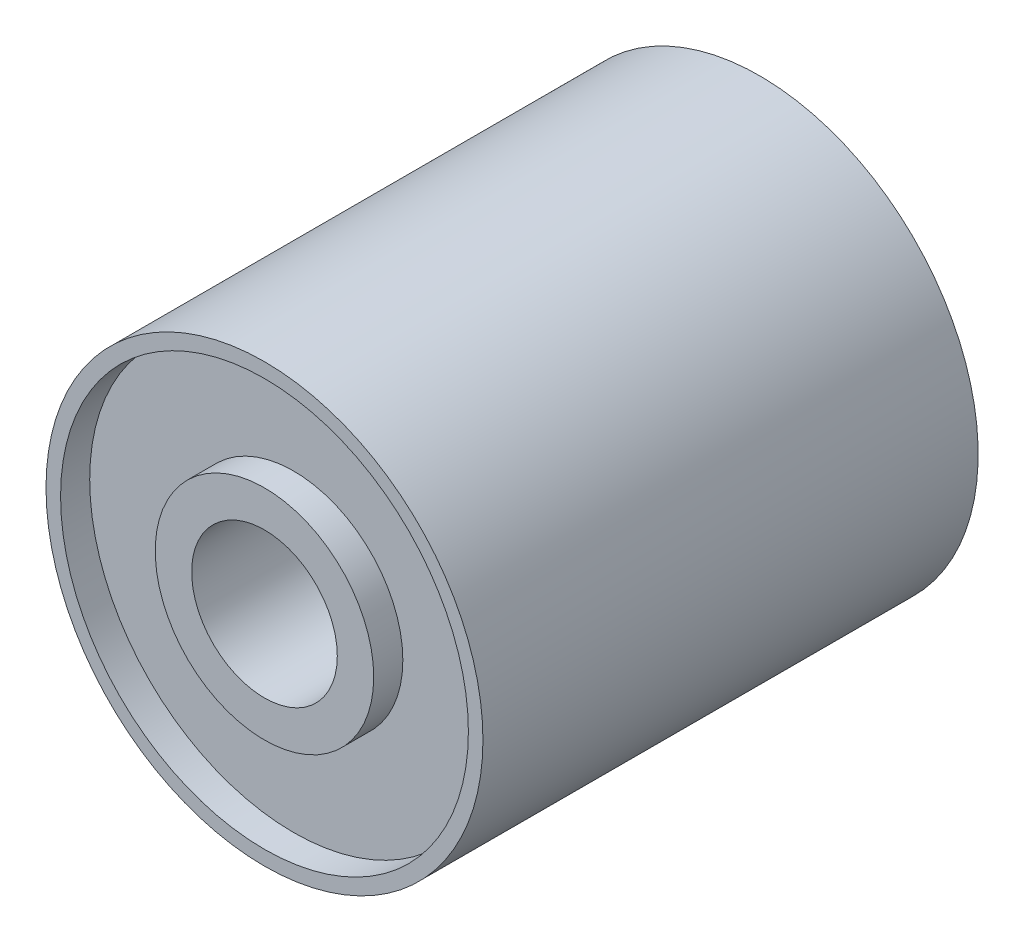
ISO-10303-21;
HEADER;
FILE_DESCRIPTION(('STEP AP214'),'2;1');
FILE_NAME('part.step','',(''),(''),'','','');
FILE_SCHEMA(('AUTOMOTIVE_DESIGN { 1 0 10303 214 1 1 1 1 }'));
ENDSEC;
DATA;
#1=APPLICATION_CONTEXT('core data for automotive mechanical design processes');
#2=APPLICATION_PROTOCOL_DEFINITION('international standard','automotive_design',2000,#1);
#3=PRODUCT_CONTEXT('',#1,'mechanical');
#4=PRODUCT('Part','Part','',(#3));
#5=PRODUCT_RELATED_PRODUCT_CATEGORY('part','',(#4));
#6=PRODUCT_DEFINITION_FORMATION('','',#4);
#7=PRODUCT_DEFINITION_CONTEXT('part definition',#1,'design');
#8=PRODUCT_DEFINITION('design','',#6,#7);
#9=PRODUCT_DEFINITION_SHAPE('','',#8);
#10=(LENGTH_UNIT() NAMED_UNIT(*) SI_UNIT(.MILLI.,.METRE.));
#11=(NAMED_UNIT(*) PLANE_ANGLE_UNIT() SI_UNIT($,.RADIAN.));
#12=(NAMED_UNIT(*) SI_UNIT($,.STERADIAN.) SOLID_ANGLE_UNIT());
#13=UNCERTAINTY_MEASURE_WITH_UNIT(LENGTH_MEASURE(1.E-05),#10,'distance_accuracy_value','');
#14=(GEOMETRIC_REPRESENTATION_CONTEXT(3) GLOBAL_UNCERTAINTY_ASSIGNED_CONTEXT((#13)) GLOBAL_UNIT_ASSIGNED_CONTEXT((#10,
#11,#12)) REPRESENTATION_CONTEXT('',''));
#15=CARTESIAN_POINT('',(0.,0.,0.));
#16=DIRECTION('',(0.,0.,1.));
#17=DIRECTION('',(1.,0.,0.));
#18=AXIS2_PLACEMENT_3D('',#15,#16,#17);
#19=CARTESIAN_POINT('',(0.,0.,3.));
#20=DIRECTION('',(0.,0.,-1.));
#21=DIRECTION('',(-1.,0.,0.));
#22=AXIS2_PLACEMENT_3D('',#19,#20,#21);
#23=CYLINDRICAL_SURFACE('',#22,1.5);
#24=CARTESIAN_POINT('',(0.,0.,3.2));
#25=DIRECTION('',(0.,0.,1.));
#26=DIRECTION('',(1.,0.,0.));
#27=AXIS2_PLACEMENT_3D('',#24,#25,#26);
#28=CIRCLE('',#27,1.5);
#29=CARTESIAN_POINT('',(1.5,0.,3.2));
#30=VERTEX_POINT('',#29);
#31=EDGE_CURVE('E43',#30,#30,#28,.T.);
#32=ORIENTED_EDGE('',*,*,#31,.F.);
#33=EDGE_LOOP('',(#32));
#34=FACE_BOUND('',#33,.T.);
#35=CARTESIAN_POINT('',(0.,0.,-0.2));
#36=DIRECTION('',(0.,0.,-1.));
#37=DIRECTION('',(-1.,0.,0.));
#38=AXIS2_PLACEMENT_3D('',#35,#36,#37);
#39=CIRCLE('',#38,1.5);
#40=CARTESIAN_POINT('',(-1.5,0.,-0.2));
#41=VERTEX_POINT('',#40);
#42=EDGE_CURVE('E52',#41,#41,#39,.T.);
#43=ORIENTED_EDGE('',*,*,#42,.F.);
#44=EDGE_LOOP('',(#43));
#45=FACE_BOUND('',#44,.T.);
#46=ADVANCED_FACE('F33',(#34,#45),#23,.T.);
#47=CARTESIAN_POINT('',(0.,0.,3.2));
#48=DIRECTION('',(0.,0.,1.));
#49=DIRECTION('',(1.,0.,0.));
#50=AXIS2_PLACEMENT_3D('',#47,#48,#49);
#51=PLANE('',#50);
#52=ORIENTED_EDGE('',*,*,#31,.T.);
#53=EDGE_LOOP('',(#52));
#54=FACE_BOUND('',#53,.T.);
#55=CARTESIAN_POINT('',(0.,0.,3.2));
#56=DIRECTION('',(0.,0.,1.));
#57=DIRECTION('',(1.,0.,0.));
#58=AXIS2_PLACEMENT_3D('',#55,#56,#57);
#59=CIRCLE('',#58,1.4);
#60=CARTESIAN_POINT('',(1.4,0.,3.2));
#61=VERTEX_POINT('',#60);
#62=EDGE_CURVE('E47',#61,#61,#59,.T.);
#63=ORIENTED_EDGE('',*,*,#62,.F.);
#64=EDGE_LOOP('',(#63));
#65=FACE_BOUND('',#64,.T.);
#66=ADVANCED_FACE('F94',(#54,#65),#51,.T.);
#67=CARTESIAN_POINT('',(0.,0.,3.2));
#68=DIRECTION('',(0.,0.,-1.));
#69=DIRECTION('',(-1.,0.,0.));
#70=AXIS2_PLACEMENT_3D('',#67,#68,#69);
#71=CYLINDRICAL_SURFACE('',#70,1.4);
#72=ORIENTED_EDGE('',*,*,#62,.T.);
#73=EDGE_LOOP('',(#72));
#74=FACE_BOUND('',#73,.T.);
#75=CARTESIAN_POINT('',(0.,0.,3.));
#76=DIRECTION('',(0.,0.,1.));
#77=DIRECTION('',(1.,0.,0.));
#78=AXIS2_PLACEMENT_3D('',#75,#76,#77);
#79=CIRCLE('',#78,1.4);
#80=CARTESIAN_POINT('',(1.4,0.,3.));
#81=VERTEX_POINT('',#80);
#82=EDGE_CURVE('E39',#81,#81,#79,.F.);
#83=ORIENTED_EDGE('',*,*,#82,.T.);
#84=EDGE_LOOP('',(#83));
#85=FACE_BOUND('',#84,.T.);
#86=ADVANCED_FACE('F99',(#74,#85),#71,.F.);
#87=CARTESIAN_POINT('',(0.,0.,3.));
#88=DIRECTION('',(0.,0.,1.));
#89=DIRECTION('',(1.,0.,0.));
#90=AXIS2_PLACEMENT_3D('',#87,#88,#89);
#91=PLANE('',#90);
#92=CARTESIAN_POINT('',(0.,0.,3.));
#93=DIRECTION('',(0.,0.,1.));
#94=DIRECTION('',(1.,0.,0.));
#95=AXIS2_PLACEMENT_3D('',#92,#93,#94);
#96=CIRCLE('',#95,0.75);
#97=CARTESIAN_POINT('',(0.75,0.,3.));
#98=VERTEX_POINT('',#97);
#99=EDGE_CURVE('E68',#98,#98,#96,.T.);
#100=ORIENTED_EDGE('',*,*,#99,.F.);
#101=EDGE_LOOP('',(#100));
#102=FACE_BOUND('',#101,.T.);
#103=ORIENTED_EDGE('',*,*,#82,.F.);
#104=EDGE_LOOP('',(#103));
#105=FACE_BOUND('',#104,.T.);
#106=ADVANCED_FACE('F110',(#102,#105),#91,.T.);
#107=CARTESIAN_POINT('',(0.,0.,-0.2));
#108=DIRECTION('',(0.,0.,-1.));
#109=DIRECTION('',(-1.,0.,0.));
#110=AXIS2_PLACEMENT_3D('',#107,#108,#109);
#111=PLANE('',#110);
#112=ORIENTED_EDGE('',*,*,#42,.T.);
#113=EDGE_LOOP('',(#112));
#114=FACE_BOUND('',#113,.T.);
#115=CARTESIAN_POINT('',(0.,0.,-0.2));
#116=DIRECTION('',(0.,0.,-1.));
#117=DIRECTION('',(-1.,0.,0.));
#118=AXIS2_PLACEMENT_3D('',#115,#116,#117);
#119=CIRCLE('',#118,1.4);
#120=CARTESIAN_POINT('',(-1.4,0.,-0.2));
#121=VERTEX_POINT('',#120);
#122=EDGE_CURVE('E55',#121,#121,#119,.T.);
#123=ORIENTED_EDGE('',*,*,#122,.F.);
#124=EDGE_LOOP('',(#123));
#125=FACE_BOUND('',#124,.T.);
#126=ADVANCED_FACE('F106',(#114,#125),#111,.T.);
#127=CARTESIAN_POINT('',(0.,0.,-0.2));
#128=DIRECTION('',(0.,0.,1.));
#129=DIRECTION('',(1.,0.,0.));
#130=AXIS2_PLACEMENT_3D('',#127,#128,#129);
#131=CYLINDRICAL_SURFACE('',#130,1.4);
#132=ORIENTED_EDGE('',*,*,#122,.T.);
#133=EDGE_LOOP('',(#132));
#134=FACE_BOUND('',#133,.T.);
#135=CARTESIAN_POINT('',(0.,0.,0.));
#136=DIRECTION('',(0.,0.,-1.));
#137=DIRECTION('',(-1.,0.,0.));
#138=AXIS2_PLACEMENT_3D('',#135,#136,#137);
#139=CIRCLE('',#138,1.4);
#140=CARTESIAN_POINT('',(-1.4,0.,0.));
#141=VERTEX_POINT('',#140);
#142=EDGE_CURVE('E56',#141,#141,#139,.T.);
#143=ORIENTED_EDGE('',*,*,#142,.F.);
#144=EDGE_LOOP('',(#143));
#145=FACE_BOUND('',#144,.T.);
#146=ADVANCED_FACE('F109',(#134,#145),#131,.F.);
#147=CARTESIAN_POINT('',(0.,0.,0.));
#148=DIRECTION('',(0.,0.,1.));
#149=DIRECTION('',(1.,0.,0.));
#150=AXIS2_PLACEMENT_3D('',#147,#148,#149);
#151=PLANE('',#150);
#152=CARTESIAN_POINT('',(0.,0.,0.));
#153=DIRECTION('',(0.,0.,1.));
#154=DIRECTION('',(1.,0.,0.));
#155=AXIS2_PLACEMENT_3D('',#152,#153,#154);
#156=CIRCLE('',#155,0.75);
#157=CARTESIAN_POINT('',(0.75,0.,0.));
#158=VERTEX_POINT('',#157);
#159=EDGE_CURVE('E10',#158,#158,#156,.F.);
#160=ORIENTED_EDGE('',*,*,#159,.F.);
#161=EDGE_LOOP('',(#160));
#162=FACE_BOUND('',#161,.T.);
#163=ORIENTED_EDGE('',*,*,#142,.T.);
#164=EDGE_LOOP('',(#163));
#165=FACE_BOUND('',#164,.T.);
#166=ADVANCED_FACE('F116',(#162,#165),#151,.F.);
#167=CARTESIAN_POINT('',(0.,0.,-0.2));
#168=DIRECTION('',(0.,0.,-1.));
#169=DIRECTION('',(-1.,0.,0.));
#170=AXIS2_PLACEMENT_3D('',#167,#168,#169);
#171=PLANE('',#170);
#172=CARTESIAN_POINT('',(0.,0.,-0.2));
#173=DIRECTION('',(0.,0.,-1.));
#174=DIRECTION('',(-1.,0.,0.));
#175=AXIS2_PLACEMENT_3D('',#172,#173,#174);
#176=CIRCLE('',#175,0.75);
#177=CARTESIAN_POINT('',(-0.75,0.,-0.2));
#178=VERTEX_POINT('',#177);
#179=EDGE_CURVE('E59',#178,#178,#176,.T.);
#180=ORIENTED_EDGE('',*,*,#179,.T.);
#181=EDGE_LOOP('',(#180));
#182=FACE_BOUND('',#181,.T.);
#183=CARTESIAN_POINT('',(0.,0.,-0.2));
#184=DIRECTION('',(0.,0.,-1.));
#185=DIRECTION('',(-1.,0.,0.));
#186=AXIS2_PLACEMENT_3D('',#183,#184,#185);
#187=CIRCLE('',#186,0.5);
#188=CARTESIAN_POINT('',(-0.5,0.,-0.2));
#189=VERTEX_POINT('',#188);
#190=EDGE_CURVE('E64',#189,#189,#187,.T.);
#191=ORIENTED_EDGE('',*,*,#190,.F.);
#192=EDGE_LOOP('',(#191));
#193=FACE_BOUND('',#192,.T.);
#194=ADVANCED_FACE('F121',(#182,#193),#171,.T.);
#195=CARTESIAN_POINT('',(0.,0.,-0.2));
#196=DIRECTION('',(0.,0.,1.));
#197=DIRECTION('',(1.,0.,0.));
#198=AXIS2_PLACEMENT_3D('',#195,#196,#197);
#199=CYLINDRICAL_SURFACE('',#198,0.75);
#200=ORIENTED_EDGE('',*,*,#179,.F.);
#201=EDGE_LOOP('',(#200));
#202=FACE_BOUND('',#201,.T.);
#203=ORIENTED_EDGE('',*,*,#159,.T.);
#204=EDGE_LOOP('',(#203));
#205=FACE_BOUND('',#204,.T.);
#206=ADVANCED_FACE('F90',(#202,#205),#199,.T.);
#207=CARTESIAN_POINT('',(0.,0.,-0.2));
#208=DIRECTION('',(0.,0.,1.));
#209=DIRECTION('',(1.,0.,0.));
#210=AXIS2_PLACEMENT_3D('',#207,#208,#209);
#211=CYLINDRICAL_SURFACE('',#210,0.5);
#212=ORIENTED_EDGE('',*,*,#190,.T.);
#213=EDGE_LOOP('',(#212));
#214=FACE_BOUND('',#213,.T.);
#215=CARTESIAN_POINT('',(0.,0.,3.2));
#216=DIRECTION('',(0.,0.,1.));
#217=DIRECTION('',(1.,0.,0.));
#218=AXIS2_PLACEMENT_3D('',#215,#216,#217);
#219=CIRCLE('',#218,0.5);
#220=CARTESIAN_POINT('',(0.5,0.,3.2));
#221=VERTEX_POINT('',#220);
#222=EDGE_CURVE('E71',#221,#221,#219,.T.);
#223=ORIENTED_EDGE('',*,*,#222,.T.);
#224=EDGE_LOOP('',(#223));
#225=FACE_BOUND('',#224,.T.);
#226=ADVANCED_FACE('F77',(#214,#225),#211,.F.);
#227=CARTESIAN_POINT('',(0.,0.,3.2));
#228=DIRECTION('',(0.,0.,1.));
#229=DIRECTION('',(1.,0.,0.));
#230=AXIS2_PLACEMENT_3D('',#227,#228,#229);
#231=PLANE('',#230);
#232=CARTESIAN_POINT('',(0.,0.,3.2));
#233=DIRECTION('',(0.,0.,1.));
#234=DIRECTION('',(1.,0.,0.));
#235=AXIS2_PLACEMENT_3D('',#232,#233,#234);
#236=CIRCLE('',#235,0.75);
#237=CARTESIAN_POINT('',(0.75,0.,3.2));
#238=VERTEX_POINT('',#237);
#239=EDGE_CURVE('E67',#238,#238,#236,.T.);
#240=ORIENTED_EDGE('',*,*,#239,.T.);
#241=EDGE_LOOP('',(#240));
#242=FACE_BOUND('',#241,.T.);
#243=ORIENTED_EDGE('',*,*,#222,.F.);
#244=EDGE_LOOP('',(#243));
#245=FACE_BOUND('',#244,.T.);
#246=ADVANCED_FACE('F79',(#242,#245),#231,.T.);
#247=CARTESIAN_POINT('',(0.,0.,3.2));
#248=DIRECTION('',(0.,0.,-1.));
#249=DIRECTION('',(-1.,0.,0.));
#250=AXIS2_PLACEMENT_3D('',#247,#248,#249);
#251=CYLINDRICAL_SURFACE('',#250,0.75);
#252=ORIENTED_EDGE('',*,*,#239,.F.);
#253=EDGE_LOOP('',(#252));
#254=FACE_BOUND('',#253,.T.);
#255=ORIENTED_EDGE('',*,*,#99,.T.);
#256=EDGE_LOOP('',(#255));
#257=FACE_BOUND('',#256,.T.);
#258=ADVANCED_FACE('F81',(#254,#257),#251,.T.);
#259=CLOSED_SHELL('',(#46,#66,#86,#106,#126,#146,#166,#194,#206,#226,#246,#258));
#260=MANIFOLD_SOLID_BREP('B2',#259);
#261=ADVANCED_BREP_SHAPE_REPRESENTATION('',(#18,#260),#14);
#262=SHAPE_DEFINITION_REPRESENTATION(#9,#261);
ENDSEC;
END-ISO-10303-21;
